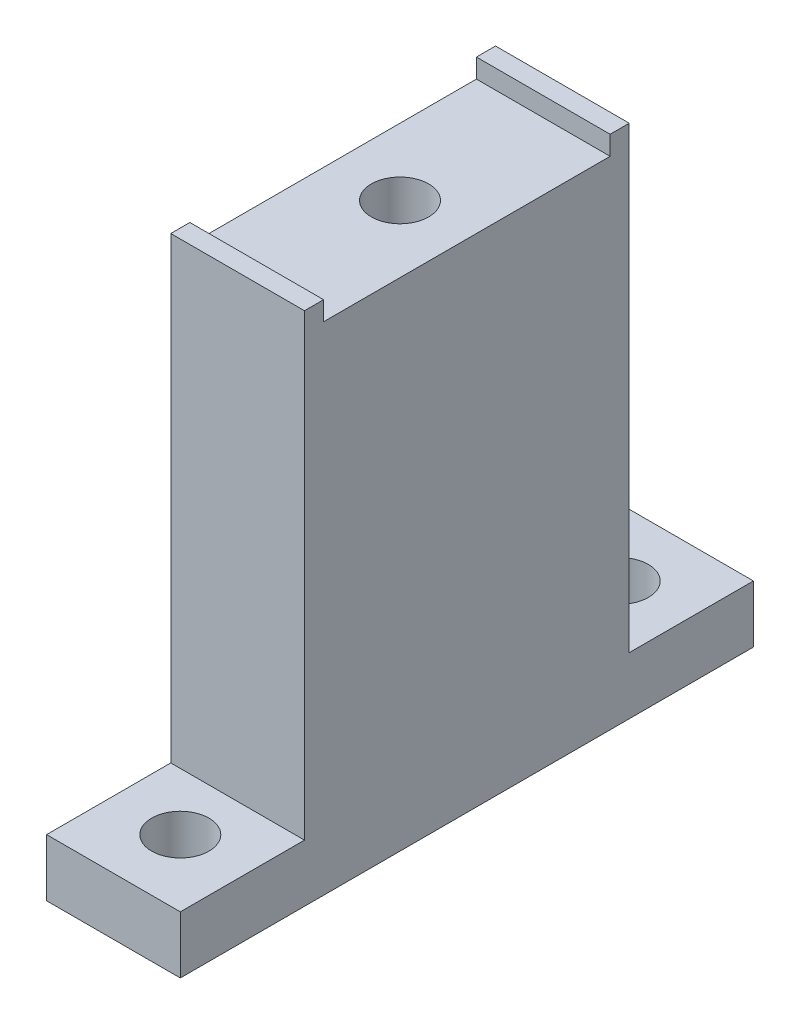
ISO-10303-21;
HEADER;
FILE_DESCRIPTION(('STEP AP214'),'2;1');
FILE_NAME('part.step','',(''),(''),'','','');
FILE_SCHEMA(('AUTOMOTIVE_DESIGN { 1 0 10303 214 1 1 1 1 }'));
ENDSEC;
DATA;
#1=APPLICATION_CONTEXT('core data for automotive mechanical design processes');
#2=APPLICATION_PROTOCOL_DEFINITION('international standard','automotive_design',2000,#1);
#3=PRODUCT_CONTEXT('',#1,'mechanical');
#4=PRODUCT('Part','Part','',(#3));
#5=PRODUCT_RELATED_PRODUCT_CATEGORY('part','',(#4));
#6=PRODUCT_DEFINITION_FORMATION('','',#4);
#7=PRODUCT_DEFINITION_CONTEXT('part definition',#1,'design');
#8=PRODUCT_DEFINITION('design','',#6,#7);
#9=PRODUCT_DEFINITION_SHAPE('','',#8);
#10=(LENGTH_UNIT() NAMED_UNIT(*) SI_UNIT(.MILLI.,.METRE.));
#11=(NAMED_UNIT(*) PLANE_ANGLE_UNIT() SI_UNIT($,.RADIAN.));
#12=(NAMED_UNIT(*) SI_UNIT($,.STERADIAN.) SOLID_ANGLE_UNIT());
#13=UNCERTAINTY_MEASURE_WITH_UNIT(LENGTH_MEASURE(1.E-05),#10,'distance_accuracy_value','');
#14=(GEOMETRIC_REPRESENTATION_CONTEXT(3) GLOBAL_UNCERTAINTY_ASSIGNED_CONTEXT((#13)) GLOBAL_UNIT_ASSIGNED_CONTEXT((#10,
#11,#12)) REPRESENTATION_CONTEXT('',''));
#15=CARTESIAN_POINT('',(0.,0.,0.));
#16=DIRECTION('',(0.,0.,1.));
#17=DIRECTION('',(1.,0.,0.));
#18=AXIS2_PLACEMENT_3D('',#15,#16,#17);
#19=CARTESIAN_POINT('',(0.,26.,0.));
#20=DIRECTION('',(0.,1.,0.));
#21=DIRECTION('',(0.,0.,1.));
#22=AXIS2_PLACEMENT_3D('',#19,#20,#21);
#23=PLANE('',#22);
#24=CARTESIAN_POINT('',(-3.5,26.,-15.));
#25=DIRECTION('',(0.,1.,0.));
#26=DIRECTION('',(0.,0.,1.));
#27=AXIS2_PLACEMENT_3D('',#24,#25,#26);
#28=CIRCLE('',#27,1.5);
#29=CARTESIAN_POINT('',(-3.5,26.,-13.5));
#30=VERTEX_POINT('',#29);
#31=EDGE_CURVE('E180',#30,#30,#28,.T.);
#32=ORIENTED_EDGE('',*,*,#31,.F.);
#33=EDGE_LOOP('',(#32));
#34=FACE_BOUND('',#33,.T.);
#35=DIRECTION('',(0.,0.,1.));
#36=VECTOR('',#35,1.);
#37=CARTESIAN_POINT('',(-7.,26.,0.));
#38=LINE('',#37,#36);
#39=CARTESIAN_POINT('',(-7.,26.,-22.5));
#40=VERTEX_POINT('',#39);
#41=CARTESIAN_POINT('',(-7.,26.,-7.5));
#42=VERTEX_POINT('',#41);
#43=EDGE_CURVE('E187',#40,#42,#38,.T.);
#44=ORIENTED_EDGE('',*,*,#43,.T.);
#45=DIRECTION('',(-1.,0.,0.));
#46=VECTOR('',#45,1.);
#47=CARTESIAN_POINT('',(-7.,26.,-7.5));
#48=LINE('',#47,#46);
#49=CARTESIAN_POINT('',(0.,26.,-7.5));
#50=VERTEX_POINT('',#49);
#51=EDGE_CURVE('E153',#50,#42,#48,.T.);
#52=ORIENTED_EDGE('',*,*,#51,.F.);
#53=DIRECTION('',(0.,0.,-1.));
#54=VECTOR('',#53,1.);
#55=CARTESIAN_POINT('',(0.,26.,0.));
#56=LINE('',#55,#54);
#57=CARTESIAN_POINT('',(0.,26.,-22.5));
#58=VERTEX_POINT('',#57);
#59=EDGE_CURVE('E189',#50,#58,#56,.T.);
#60=ORIENTED_EDGE('',*,*,#59,.T.);
#61=DIRECTION('',(1.,0.,0.));
#62=VECTOR('',#61,1.);
#63=CARTESIAN_POINT('',(-7.,26.,-22.5));
#64=LINE('',#63,#62);
#65=EDGE_CURVE('E60',#40,#58,#64,.T.);
#66=ORIENTED_EDGE('',*,*,#65,.F.);
#67=EDGE_LOOP('',(#44,#52,#60,#66));
#68=FACE_BOUND('',#67,.T.);
#69=ADVANCED_FACE('F37',(#34,#68),#23,.T.);
#70=CARTESIAN_POINT('',(0.,3.,0.));
#71=DIRECTION('',(0.,1.,0.));
#72=DIRECTION('',(0.,0.,1.));
#73=AXIS2_PLACEMENT_3D('',#70,#71,#72);
#74=PLANE('',#73);
#75=CARTESIAN_POINT('',(-3.5,3.,-26.5));
#76=DIRECTION('',(0.,1.,0.));
#77=DIRECTION('',(0.,0.,1.));
#78=AXIS2_PLACEMENT_3D('',#75,#76,#77);
#79=CIRCLE('',#78,1.5);
#80=CARTESIAN_POINT('',(-3.5,3.,-25.));
#81=VERTEX_POINT('',#80);
#82=EDGE_CURVE('E205',#81,#81,#79,.T.);
#83=ORIENTED_EDGE('',*,*,#82,.F.);
#84=EDGE_LOOP('',(#83));
#85=FACE_BOUND('',#84,.T.);
#86=DIRECTION('',(0.,0.,1.));
#87=VECTOR('',#86,1.);
#88=CARTESIAN_POINT('',(-7.,3.,0.));
#89=LINE('',#88,#87);
#90=CARTESIAN_POINT('',(-7.,3.,-30.));
#91=VERTEX_POINT('',#90);
#92=CARTESIAN_POINT('',(-7.,3.,-23.5));
#93=VERTEX_POINT('',#92);
#94=EDGE_CURVE('E218',#91,#93,#89,.T.);
#95=ORIENTED_EDGE('',*,*,#94,.T.);
#96=DIRECTION('',(1.,0.,0.));
#97=VECTOR('',#96,1.);
#98=CARTESIAN_POINT('',(0.,3.,-23.5));
#99=LINE('',#98,#97);
#100=CARTESIAN_POINT('',(0.,3.,-23.5));
#101=VERTEX_POINT('',#100);
#102=EDGE_CURVE('E184',#93,#101,#99,.T.);
#103=ORIENTED_EDGE('',*,*,#102,.T.);
#104=DIRECTION('',(0.,0.,-1.));
#105=VECTOR('',#104,1.);
#106=CARTESIAN_POINT('',(0.,3.,0.));
#107=LINE('',#106,#105);
#108=CARTESIAN_POINT('',(0.,3.,-30.));
#109=VERTEX_POINT('',#108);
#110=EDGE_CURVE('E216',#101,#109,#107,.T.);
#111=ORIENTED_EDGE('',*,*,#110,.T.);
#112=DIRECTION('',(-1.,0.,0.));
#113=VECTOR('',#112,1.);
#114=CARTESIAN_POINT('',(0.,3.,-30.));
#115=LINE('',#114,#113);
#116=EDGE_CURVE('E215',#109,#91,#115,.T.);
#117=ORIENTED_EDGE('',*,*,#116,.T.);
#118=EDGE_LOOP('',(#95,#103,#111,#117));
#119=FACE_BOUND('',#118,.T.);
#120=ADVANCED_FACE('F257',(#85,#119),#74,.T.);
#121=CARTESIAN_POINT('',(0.,3.,0.));
#122=DIRECTION('',(-1.,0.,0.));
#123=DIRECTION('',(0.,0.,1.));
#124=AXIS2_PLACEMENT_3D('',#121,#122,#123);
#125=PLANE('',#124);
#126=DIRECTION('',(0.,0.,-1.));
#127=VECTOR('',#126,1.);
#128=CARTESIAN_POINT('',(0.,0.,0.));
#129=LINE('',#128,#127);
#130=CARTESIAN_POINT('',(0.,0.,0.));
#131=VERTEX_POINT('',#130);
#132=CARTESIAN_POINT('',(0.,0.,-30.));
#133=VERTEX_POINT('',#132);
#134=EDGE_CURVE('E204',#131,#133,#129,.T.);
#135=ORIENTED_EDGE('',*,*,#134,.T.);
#136=DIRECTION('',(0.,-1.,0.));
#137=VECTOR('',#136,1.);
#138=CARTESIAN_POINT('',(0.,3.,-30.));
#139=LINE('',#138,#137);
#140=EDGE_CURVE('E11',#109,#133,#139,.T.);
#141=ORIENTED_EDGE('',*,*,#140,.F.);
#142=ORIENTED_EDGE('',*,*,#110,.F.);
#143=DIRECTION('',(0.,-1.,0.));
#144=VECTOR('',#143,1.);
#145=CARTESIAN_POINT('',(0.,26.,-23.5));
#146=LINE('',#145,#144);
#147=CARTESIAN_POINT('',(0.,27.,-23.5));
#148=VERTEX_POINT('',#147);
#149=EDGE_CURVE('E192',#148,#101,#146,.T.);
#150=ORIENTED_EDGE('',*,*,#149,.F.);
#151=DIRECTION('',(0.,0.,-1.));
#152=VECTOR('',#151,1.);
#153=CARTESIAN_POINT('',(0.,27.,-23.5));
#154=LINE('',#153,#152);
#155=CARTESIAN_POINT('',(0.,27.,-22.5));
#156=VERTEX_POINT('',#155);
#157=EDGE_CURVE('E167',#156,#148,#154,.T.);
#158=ORIENTED_EDGE('',*,*,#157,.F.);
#159=DIRECTION('',(0.,-1.,0.));
#160=VECTOR('',#159,1.);
#161=CARTESIAN_POINT('',(0.,27.,-22.5));
#162=LINE('',#161,#160);
#163=EDGE_CURVE('E173',#156,#58,#162,.T.);
#164=ORIENTED_EDGE('',*,*,#163,.T.);
#165=ORIENTED_EDGE('',*,*,#59,.F.);
#166=DIRECTION('',(0.,-1.,0.));
#167=VECTOR('',#166,1.);
#168=CARTESIAN_POINT('',(0.,27.,-7.5));
#169=LINE('',#168,#167);
#170=CARTESIAN_POINT('',(0.,27.,-7.5));
#171=VERTEX_POINT('',#170);
#172=EDGE_CURVE('E52',#171,#50,#169,.T.);
#173=ORIENTED_EDGE('',*,*,#172,.F.);
#174=DIRECTION('',(0.,0.,-1.));
#175=VECTOR('',#174,1.);
#176=CARTESIAN_POINT('',(0.,27.,-6.5));
#177=LINE('',#176,#175);
#178=CARTESIAN_POINT('',(0.,27.,-6.5));
#179=VERTEX_POINT('',#178);
#180=EDGE_CURVE('E148',#179,#171,#177,.T.);
#181=ORIENTED_EDGE('',*,*,#180,.F.);
#182=DIRECTION('',(0.,-1.,0.));
#183=VECTOR('',#182,1.);
#184=CARTESIAN_POINT('',(0.,26.,-6.5));
#185=LINE('',#184,#183);
#186=CARTESIAN_POINT('',(0.,3.,-6.5));
#187=VERTEX_POINT('',#186);
#188=EDGE_CURVE('E140',#179,#187,#185,.T.);
#189=ORIENTED_EDGE('',*,*,#188,.T.);
#190=CARTESIAN_POINT('',(0.,3.,0.));
#191=VERTEX_POINT('',#190);
#192=EDGE_CURVE('E213',#191,#187,#107,.T.);
#193=ORIENTED_EDGE('',*,*,#192,.F.);
#194=DIRECTION('',(0.,-1.,0.));
#195=VECTOR('',#194,1.);
#196=CARTESIAN_POINT('',(0.,3.,0.));
#197=LINE('',#196,#195);
#198=EDGE_CURVE('E222',#191,#131,#197,.T.);
#199=ORIENTED_EDGE('',*,*,#198,.T.);
#200=EDGE_LOOP('',(#135,#141,#142,#150,#158,#164,#165,#173,#181,#189,#193,#199));
#201=FACE_BOUND('',#200,.T.);
#202=ADVANCED_FACE('F39',(#201),#125,.F.);
#203=CARTESIAN_POINT('',(0.,3.,-30.));
#204=DIRECTION('',(0.,0.,1.));
#205=DIRECTION('',(1.,0.,0.));
#206=AXIS2_PLACEMENT_3D('',#203,#204,#205);
#207=PLANE('',#206);
#208=DIRECTION('',(-1.,0.,0.));
#209=VECTOR('',#208,1.);
#210=CARTESIAN_POINT('',(0.,0.,-30.));
#211=LINE('',#210,#209);
#212=CARTESIAN_POINT('',(-7.,0.,-30.));
#213=VERTEX_POINT('',#212);
#214=EDGE_CURVE('E225',#133,#213,#211,.T.);
#215=ORIENTED_EDGE('',*,*,#214,.T.);
#216=DIRECTION('',(0.,-1.,0.));
#217=VECTOR('',#216,1.);
#218=CARTESIAN_POINT('',(-7.,3.,-30.));
#219=LINE('',#218,#217);
#220=EDGE_CURVE('E45',#91,#213,#219,.T.);
#221=ORIENTED_EDGE('',*,*,#220,.F.);
#222=ORIENTED_EDGE('',*,*,#116,.F.);
#223=ORIENTED_EDGE('',*,*,#140,.T.);
#224=EDGE_LOOP('',(#215,#221,#222,#223));
#225=FACE_BOUND('',#224,.T.);
#226=ADVANCED_FACE('F298',(#225),#207,.F.);
#227=CARTESIAN_POINT('',(-7.,3.,0.));
#228=DIRECTION('',(1.,0.,0.));
#229=DIRECTION('',(0.,0.,-1.));
#230=AXIS2_PLACEMENT_3D('',#227,#228,#229);
#231=PLANE('',#230);
#232=DIRECTION('',(0.,0.,1.));
#233=VECTOR('',#232,1.);
#234=CARTESIAN_POINT('',(-7.,0.,0.));
#235=LINE('',#234,#233);
#236=CARTESIAN_POINT('',(-7.,0.,0.));
#237=VERTEX_POINT('',#236);
#238=EDGE_CURVE('E227',#213,#237,#235,.T.);
#239=ORIENTED_EDGE('',*,*,#238,.T.);
#240=DIRECTION('',(0.,-1.,0.));
#241=VECTOR('',#240,1.);
#242=CARTESIAN_POINT('',(-7.,3.,0.));
#243=LINE('',#242,#241);
#244=CARTESIAN_POINT('',(-7.,3.,0.));
#245=VERTEX_POINT('',#244);
#246=EDGE_CURVE('E233',#245,#237,#243,.T.);
#247=ORIENTED_EDGE('',*,*,#246,.F.);
#248=CARTESIAN_POINT('',(-7.,3.,-6.5));
#249=VERTEX_POINT('',#248);
#250=EDGE_CURVE('E136',#249,#245,#89,.T.);
#251=ORIENTED_EDGE('',*,*,#250,.F.);
#252=DIRECTION('',(0.,-1.,0.));
#253=VECTOR('',#252,1.);
#254=CARTESIAN_POINT('',(-7.,26.,-6.5));
#255=LINE('',#254,#253);
#256=CARTESIAN_POINT('',(-7.,27.,-6.5));
#257=VERTEX_POINT('',#256);
#258=EDGE_CURVE('E129',#257,#249,#255,.T.);
#259=ORIENTED_EDGE('',*,*,#258,.F.);
#260=DIRECTION('',(0.,0.,1.));
#261=VECTOR('',#260,1.);
#262=CARTESIAN_POINT('',(-7.,27.,-6.5));
#263=LINE('',#262,#261);
#264=CARTESIAN_POINT('',(-7.,27.,-7.5));
#265=VERTEX_POINT('',#264);
#266=EDGE_CURVE('E134',#265,#257,#263,.T.);
#267=ORIENTED_EDGE('',*,*,#266,.F.);
#268=DIRECTION('',(0.,-1.,0.));
#269=VECTOR('',#268,1.);
#270=CARTESIAN_POINT('',(-7.,27.,-7.5));
#271=LINE('',#270,#269);
#272=EDGE_CURVE('E158',#265,#42,#271,.T.);
#273=ORIENTED_EDGE('',*,*,#272,.T.);
#274=ORIENTED_EDGE('',*,*,#43,.F.);
#275=DIRECTION('',(0.,-1.,0.));
#276=VECTOR('',#275,1.);
#277=CARTESIAN_POINT('',(-7.,27.,-22.5));
#278=LINE('',#277,#276);
#279=CARTESIAN_POINT('',(-7.,27.,-22.5));
#280=VERTEX_POINT('',#279);
#281=EDGE_CURVE('E177',#280,#40,#278,.T.);
#282=ORIENTED_EDGE('',*,*,#281,.F.);
#283=DIRECTION('',(0.,0.,1.));
#284=VECTOR('',#283,1.);
#285=CARTESIAN_POINT('',(-7.,27.,-23.5));
#286=LINE('',#285,#284);
#287=CARTESIAN_POINT('',(-7.,27.,-23.5));
#288=VERTEX_POINT('',#287);
#289=EDGE_CURVE('E162',#288,#280,#286,.T.);
#290=ORIENTED_EDGE('',*,*,#289,.F.);
#291=DIRECTION('',(0.,-1.,0.));
#292=VECTOR('',#291,1.);
#293=CARTESIAN_POINT('',(-7.,26.,-23.5));
#294=LINE('',#293,#292);
#295=EDGE_CURVE('E139',#288,#93,#294,.T.);
#296=ORIENTED_EDGE('',*,*,#295,.T.);
#297=ORIENTED_EDGE('',*,*,#94,.F.);
#298=ORIENTED_EDGE('',*,*,#220,.T.);
#299=EDGE_LOOP('',(#239,#247,#251,#259,#267,#273,#274,#282,#290,#296,#297,#298));
#300=FACE_BOUND('',#299,.T.);
#301=ADVANCED_FACE('F131',(#300),#231,.F.);
#302=CARTESIAN_POINT('',(0.,3.,0.));
#303=DIRECTION('',(0.,0.,-1.));
#304=DIRECTION('',(-1.,0.,0.));
#305=AXIS2_PLACEMENT_3D('',#302,#303,#304);
#306=PLANE('',#305);
#307=DIRECTION('',(1.,0.,0.));
#308=VECTOR('',#307,1.);
#309=CARTESIAN_POINT('',(0.,0.,0.));
#310=LINE('',#309,#308);
#311=EDGE_CURVE('E229',#237,#131,#310,.T.);
#312=ORIENTED_EDGE('',*,*,#311,.T.);
#313=ORIENTED_EDGE('',*,*,#198,.F.);
#314=DIRECTION('',(1.,0.,0.));
#315=VECTOR('',#314,1.);
#316=CARTESIAN_POINT('',(0.,3.,0.));
#317=LINE('',#316,#315);
#318=EDGE_CURVE('E220',#245,#191,#317,.T.);
#319=ORIENTED_EDGE('',*,*,#318,.F.);
#320=ORIENTED_EDGE('',*,*,#246,.T.);
#321=EDGE_LOOP('',(#312,#313,#319,#320));
#322=FACE_BOUND('',#321,.T.);
#323=ADVANCED_FACE('F247',(#322),#306,.F.);
#324=DIRECTION('',(1.,0.,0.));
#325=VECTOR('',#324,1.);
#326=CARTESIAN_POINT('',(0.,3.,-6.5));
#327=LINE('',#326,#325);
#328=EDGE_CURVE('E190',#249,#187,#327,.T.);
#329=ORIENTED_EDGE('',*,*,#328,.F.);
#330=ORIENTED_EDGE('',*,*,#250,.T.);
#331=ORIENTED_EDGE('',*,*,#318,.T.);
#332=ORIENTED_EDGE('',*,*,#192,.T.);
#333=EDGE_LOOP('',(#329,#330,#331,#332));
#334=FACE_BOUND('',#333,.T.);
#335=CARTESIAN_POINT('',(-3.5,3.,-3.5));
#336=DIRECTION('',(0.,1.,0.));
#337=DIRECTION('',(0.,0.,1.));
#338=AXIS2_PLACEMENT_3D('',#335,#336,#337);
#339=CIRCLE('',#338,1.5);
#340=CARTESIAN_POINT('',(-3.5,3.,-2.));
#341=VERTEX_POINT('',#340);
#342=EDGE_CURVE('E208',#341,#341,#339,.T.);
#343=ORIENTED_EDGE('',*,*,#342,.F.);
#344=EDGE_LOOP('',(#343));
#345=FACE_BOUND('',#344,.T.);
#346=ADVANCED_FACE('F253',(#334,#345),#74,.T.);
#347=CARTESIAN_POINT('',(0.,0.,0.));
#348=DIRECTION('',(0.,1.,0.));
#349=DIRECTION('',(0.,0.,1.));
#350=AXIS2_PLACEMENT_3D('',#347,#348,#349);
#351=PLANE('',#350);
#352=CARTESIAN_POINT('',(-3.5,0.,-26.5));
#353=DIRECTION('',(0.,1.,0.));
#354=DIRECTION('',(0.,0.,1.));
#355=AXIS2_PLACEMENT_3D('',#352,#353,#354);
#356=CIRCLE('',#355,1.5);
#357=CARTESIAN_POINT('',(-3.5,0.,-25.));
#358=VERTEX_POINT('',#357);
#359=EDGE_CURVE('E201',#358,#358,#356,.T.);
#360=ORIENTED_EDGE('',*,*,#359,.T.);
#361=EDGE_LOOP('',(#360));
#362=FACE_BOUND('',#361,.T.);
#363=CARTESIAN_POINT('',(-3.5,0.,-3.5));
#364=DIRECTION('',(0.,1.,0.));
#365=DIRECTION('',(0.,0.,1.));
#366=AXIS2_PLACEMENT_3D('',#363,#364,#365);
#367=CIRCLE('',#366,1.5);
#368=CARTESIAN_POINT('',(-3.5,0.,-2.));
#369=VERTEX_POINT('',#368);
#370=EDGE_CURVE('E200',#369,#369,#367,.T.);
#371=ORIENTED_EDGE('',*,*,#370,.T.);
#372=EDGE_LOOP('',(#371));
#373=FACE_BOUND('',#372,.T.);
#374=ORIENTED_EDGE('',*,*,#134,.F.);
#375=ORIENTED_EDGE('',*,*,#311,.F.);
#376=ORIENTED_EDGE('',*,*,#238,.F.);
#377=ORIENTED_EDGE('',*,*,#214,.F.);
#378=EDGE_LOOP('',(#374,#375,#376,#377));
#379=FACE_BOUND('',#378,.T.);
#380=ADVANCED_FACE('F244',(#362,#373,#379),#351,.F.);
#381=CARTESIAN_POINT('',(-3.5,0.,-3.5));
#382=DIRECTION('',(0.,1.,0.));
#383=DIRECTION('',(0.,0.,1.));
#384=AXIS2_PLACEMENT_3D('',#381,#382,#383);
#385=CYLINDRICAL_SURFACE('',#384,1.5);
#386=ORIENTED_EDGE('',*,*,#370,.F.);
#387=EDGE_LOOP('',(#386));
#388=FACE_BOUND('',#387,.T.);
#389=ORIENTED_EDGE('',*,*,#342,.T.);
#390=EDGE_LOOP('',(#389));
#391=FACE_BOUND('',#390,.T.);
#392=ADVANCED_FACE('F260',(#388,#391),#385,.F.);
#393=CARTESIAN_POINT('',(-3.5,0.,-26.5));
#394=DIRECTION('',(0.,1.,0.));
#395=DIRECTION('',(0.,0.,1.));
#396=AXIS2_PLACEMENT_3D('',#393,#394,#395);
#397=CYLINDRICAL_SURFACE('',#396,1.5);
#398=ORIENTED_EDGE('',*,*,#359,.F.);
#399=EDGE_LOOP('',(#398));
#400=FACE_BOUND('',#399,.T.);
#401=ORIENTED_EDGE('',*,*,#82,.T.);
#402=EDGE_LOOP('',(#401));
#403=FACE_BOUND('',#402,.T.);
#404=ADVANCED_FACE('F262',(#400,#403),#397,.F.);
#405=CARTESIAN_POINT('',(0.,26.,-23.5));
#406=DIRECTION('',(0.,0.,-1.));
#407=DIRECTION('',(-1.,0.,0.));
#408=AXIS2_PLACEMENT_3D('',#405,#406,#407);
#409=PLANE('',#408);
#410=ORIENTED_EDGE('',*,*,#102,.F.);
#411=ORIENTED_EDGE('',*,*,#295,.F.);
#412=DIRECTION('',(-1.,0.,0.));
#413=VECTOR('',#412,1.);
#414=CARTESIAN_POINT('',(-7.,27.,-23.5));
#415=LINE('',#414,#413);
#416=EDGE_CURVE('E170',#148,#288,#415,.T.);
#417=ORIENTED_EDGE('',*,*,#416,.F.);
#418=ORIENTED_EDGE('',*,*,#149,.T.);
#419=EDGE_LOOP('',(#410,#411,#417,#418));
#420=FACE_BOUND('',#419,.T.);
#421=ADVANCED_FACE('F269',(#420),#409,.T.);
#422=CARTESIAN_POINT('',(0.,26.,-6.5));
#423=DIRECTION('',(0.,0.,-1.));
#424=DIRECTION('',(-1.,0.,0.));
#425=AXIS2_PLACEMENT_3D('',#422,#423,#424);
#426=PLANE('',#425);
#427=ORIENTED_EDGE('',*,*,#328,.T.);
#428=ORIENTED_EDGE('',*,*,#188,.F.);
#429=DIRECTION('',(1.,0.,0.));
#430=VECTOR('',#429,1.);
#431=CARTESIAN_POINT('',(-7.,27.,-6.5));
#432=LINE('',#431,#430);
#433=EDGE_CURVE('E143',#257,#179,#432,.T.);
#434=ORIENTED_EDGE('',*,*,#433,.F.);
#435=ORIENTED_EDGE('',*,*,#258,.T.);
#436=EDGE_LOOP('',(#427,#428,#434,#435));
#437=FACE_BOUND('',#436,.T.);
#438=ADVANCED_FACE('F144',(#437),#426,.F.);
#439=CARTESIAN_POINT('',(-3.5,14.,-15.));
#440=DIRECTION('',(0.,1.,0.));
#441=DIRECTION('',(0.,0.,1.));
#442=AXIS2_PLACEMENT_3D('',#439,#440,#441);
#443=CYLINDRICAL_SURFACE('',#442,1.5);
#444=CARTESIAN_POINT('',(-3.5,14.,-15.));
#445=DIRECTION('',(0.,1.,0.));
#446=DIRECTION('',(0.,0.,1.));
#447=AXIS2_PLACEMENT_3D('',#444,#445,#446);
#448=CIRCLE('',#447,1.5);
#449=CARTESIAN_POINT('',(-3.5,14.,-13.5));
#450=VERTEX_POINT('',#449);
#451=EDGE_CURVE('E181',#450,#450,#448,.T.);
#452=ORIENTED_EDGE('',*,*,#451,.F.);
#453=EDGE_LOOP('',(#452));
#454=FACE_BOUND('',#453,.T.);
#455=ORIENTED_EDGE('',*,*,#31,.T.);
#456=EDGE_LOOP('',(#455));
#457=FACE_BOUND('',#456,.T.);
#458=ADVANCED_FACE('F285',(#454,#457),#443,.F.);
#459=CARTESIAN_POINT('',(-3.5,14.,-15.));
#460=DIRECTION('',(0.,1.,0.));
#461=DIRECTION('',(0.,0.,1.));
#462=AXIS2_PLACEMENT_3D('',#459,#460,#461);
#463=PLANE('',#462);
#464=ORIENTED_EDGE('',*,*,#451,.T.);
#465=EDGE_LOOP('',(#464));
#466=FACE_BOUND('',#465,.T.);
#467=ADVANCED_FACE('F376',(#466),#463,.T.);
#468=CARTESIAN_POINT('',(-7.,27.,-22.5));
#469=DIRECTION('',(0.,0.,-1.));
#470=DIRECTION('',(-1.,0.,0.));
#471=AXIS2_PLACEMENT_3D('',#468,#469,#470);
#472=PLANE('',#471);
#473=ORIENTED_EDGE('',*,*,#65,.T.);
#474=ORIENTED_EDGE('',*,*,#163,.F.);
#475=DIRECTION('',(1.,0.,0.));
#476=VECTOR('',#475,1.);
#477=CARTESIAN_POINT('',(-7.,27.,-22.5));
#478=LINE('',#477,#476);
#479=EDGE_CURVE('E165',#280,#156,#478,.T.);
#480=ORIENTED_EDGE('',*,*,#479,.F.);
#481=ORIENTED_EDGE('',*,*,#281,.T.);
#482=EDGE_LOOP('',(#473,#474,#480,#481));
#483=FACE_BOUND('',#482,.T.);
#484=ADVANCED_FACE('F371',(#483),#472,.F.);
#485=CARTESIAN_POINT('',(0.,27.,0.));
#486=DIRECTION('',(0.,1.,0.));
#487=DIRECTION('',(0.,0.,1.));
#488=AXIS2_PLACEMENT_3D('',#485,#486,#487);
#489=PLANE('',#488);
#490=ORIENTED_EDGE('',*,*,#289,.T.);
#491=ORIENTED_EDGE('',*,*,#479,.T.);
#492=ORIENTED_EDGE('',*,*,#157,.T.);
#493=ORIENTED_EDGE('',*,*,#416,.T.);
#494=EDGE_LOOP('',(#490,#491,#492,#493));
#495=FACE_BOUND('',#494,.T.);
#496=ADVANCED_FACE('F375',(#495),#489,.T.);
#497=CARTESIAN_POINT('',(-7.,27.,-7.5));
#498=DIRECTION('',(0.,0.,1.));
#499=DIRECTION('',(1.,0.,0.));
#500=AXIS2_PLACEMENT_3D('',#497,#498,#499);
#501=PLANE('',#500);
#502=ORIENTED_EDGE('',*,*,#51,.T.);
#503=ORIENTED_EDGE('',*,*,#272,.F.);
#504=DIRECTION('',(-1.,0.,0.));
#505=VECTOR('',#504,1.);
#506=CARTESIAN_POINT('',(-7.,27.,-7.5));
#507=LINE('',#506,#505);
#508=EDGE_CURVE('E151',#171,#265,#507,.T.);
#509=ORIENTED_EDGE('',*,*,#508,.F.);
#510=ORIENTED_EDGE('',*,*,#172,.T.);
#511=EDGE_LOOP('',(#502,#503,#509,#510));
#512=FACE_BOUND('',#511,.T.);
#513=ADVANCED_FACE('F387',(#512),#501,.F.);
#514=CARTESIAN_POINT('',(0.,27.,0.));
#515=DIRECTION('',(0.,-1.,0.));
#516=DIRECTION('',(0.,0.,-1.));
#517=AXIS2_PLACEMENT_3D('',#514,#515,#516);
#518=PLANE('',#517);
#519=ORIENTED_EDGE('',*,*,#266,.T.);
#520=ORIENTED_EDGE('',*,*,#433,.T.);
#521=ORIENTED_EDGE('',*,*,#180,.T.);
#522=ORIENTED_EDGE('',*,*,#508,.T.);
#523=EDGE_LOOP('',(#519,#520,#521,#522));
#524=FACE_BOUND('',#523,.T.);
#525=ADVANCED_FACE('F150',(#524),#518,.F.);
#526=CLOSED_SHELL('',(#69,#120,#202,#226,#301,#323,#346,#380,#392,#404,#421,#438,#458,#467,#484,
#496,#513,#525));
#527=MANIFOLD_SOLID_BREP('B2',#526);
#528=ADVANCED_BREP_SHAPE_REPRESENTATION('',(#18,#527),#14);
#529=SHAPE_DEFINITION_REPRESENTATION(#9,#528);
ENDSEC;
END-ISO-10303-21;
